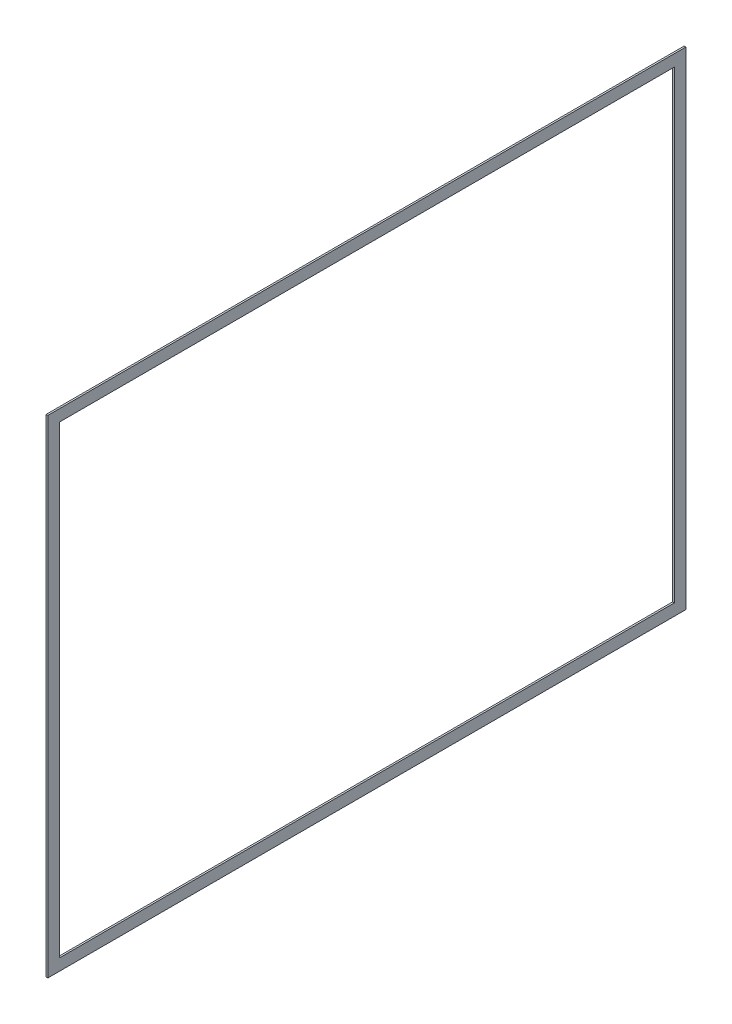
ISO-10303-21;
HEADER;
FILE_DESCRIPTION(('STEP AP214'),'2;1');
FILE_NAME('part.step','',(''),(''),'','','');
FILE_SCHEMA(('AUTOMOTIVE_DESIGN { 1 0 10303 214 1 1 1 1 }'));
ENDSEC;
DATA;
#1=APPLICATION_CONTEXT('core data for automotive mechanical design processes');
#2=APPLICATION_PROTOCOL_DEFINITION('international standard','automotive_design',2000,#1);
#3=PRODUCT_CONTEXT('',#1,'mechanical');
#4=PRODUCT('Part','Part','',(#3));
#5=PRODUCT_RELATED_PRODUCT_CATEGORY('part','',(#4));
#6=PRODUCT_DEFINITION_FORMATION('','',#4);
#7=PRODUCT_DEFINITION_CONTEXT('part definition',#1,'design');
#8=PRODUCT_DEFINITION('design','',#6,#7);
#9=PRODUCT_DEFINITION_SHAPE('','',#8);
#10=(LENGTH_UNIT() NAMED_UNIT(*) SI_UNIT(.MILLI.,.METRE.));
#11=(NAMED_UNIT(*) PLANE_ANGLE_UNIT() SI_UNIT($,.RADIAN.));
#12=(NAMED_UNIT(*) SI_UNIT($,.STERADIAN.) SOLID_ANGLE_UNIT());
#13=UNCERTAINTY_MEASURE_WITH_UNIT(LENGTH_MEASURE(1.E-05),#10,'distance_accuracy_value','');
#14=(GEOMETRIC_REPRESENTATION_CONTEXT(3) GLOBAL_UNCERTAINTY_ASSIGNED_CONTEXT((#13)) GLOBAL_UNIT_ASSIGNED_CONTEXT((#10,
#11,#12)) REPRESENTATION_CONTEXT('',''));
#15=CARTESIAN_POINT('',(0.,0.,0.));
#16=DIRECTION('',(0.,0.,1.));
#17=DIRECTION('',(1.,0.,0.));
#18=AXIS2_PLACEMENT_3D('',#15,#16,#17);
#19=CARTESIAN_POINT('',(537.21,0.,698.525000000038));
#20=DIRECTION('',(1.,0.,0.));
#21=DIRECTION('',(0.,0.,-1.));
#22=AXIS2_PLACEMENT_3D('',#19,#20,#21);
#23=PLANE('',#22);
#24=DIRECTION('',(0.,0.,-1.));
#25=VECTOR('',#24,1.);
#26=CARTESIAN_POINT('',(537.21,508.,417.48526692391));
#27=LINE('',#26,#25);
#28=CARTESIAN_POINT('',(537.21,508.,25.4));
#29=VERTEX_POINT('',#28);
#30=CARTESIAN_POINT('',(537.21,508.,1371.6));
#31=VERTEX_POINT('',#30);
#32=EDGE_CURVE('E109',#29,#31,#27,.F.);
#33=ORIENTED_EDGE('',*,*,#32,.F.);
#34=DIRECTION('',(0.,1.,0.));
#35=VECTOR('',#34,1.);
#36=CARTESIAN_POINT('',(537.21,20.8030939102161,25.4));
#37=LINE('',#36,#35);
#38=CARTESIAN_POINT('',(537.21,-508.,25.4));
#39=VERTEX_POINT('',#38);
#40=EDGE_CURVE('E116',#29,#39,#37,.F.);
#41=ORIENTED_EDGE('',*,*,#40,.T.);
#42=DIRECTION('',(0.,0.,-1.));
#43=VECTOR('',#42,1.);
#44=CARTESIAN_POINT('',(537.21,-508.,417.48526692391));
#45=LINE('',#44,#43);
#46=CARTESIAN_POINT('',(537.21,-508.,1371.6));
#47=VERTEX_POINT('',#46);
#48=EDGE_CURVE('E119',#39,#47,#45,.F.);
#49=ORIENTED_EDGE('',*,*,#48,.T.);
#50=DIRECTION('',(0.,1.,0.));
#51=VECTOR('',#50,1.);
#52=CARTESIAN_POINT('',(537.21,-61.4601382255534,1371.6));
#53=LINE('',#52,#51);
#54=EDGE_CURVE('E107',#31,#47,#53,.F.);
#55=ORIENTED_EDGE('',*,*,#54,.F.);
#56=EDGE_LOOP('',(#33,#41,#49,#55));
#57=FACE_BOUND('',#56,.T.);
#58=DIRECTION('',(0.,1.,0.));
#59=VECTOR('',#58,1.);
#60=CARTESIAN_POINT('',(537.21,20.8030939102161,0.));
#61=LINE('',#60,#59);
#62=CARTESIAN_POINT('',(537.21,533.4,0.));
#63=VERTEX_POINT('',#62);
#64=CARTESIAN_POINT('',(537.21,-533.4,0.));
#65=VERTEX_POINT('',#64);
#66=EDGE_CURVE('E79',#63,#65,#61,.F.);
#67=ORIENTED_EDGE('',*,*,#66,.F.);
#68=DIRECTION('',(0.,0.,-1.));
#69=VECTOR('',#68,1.);
#70=CARTESIAN_POINT('',(537.21,533.4,417.48526692391));
#71=LINE('',#70,#69);
#72=CARTESIAN_POINT('',(537.21,533.4,1397.));
#73=VERTEX_POINT('',#72);
#74=EDGE_CURVE('E98',#63,#73,#71,.F.);
#75=ORIENTED_EDGE('',*,*,#74,.T.);
#76=DIRECTION('',(0.,1.,0.));
#77=VECTOR('',#76,1.);
#78=CARTESIAN_POINT('',(537.21,-586.839999999898,1397.));
#79=LINE('',#78,#77);
#80=CARTESIAN_POINT('',(537.21,-533.4,1397.));
#81=VERTEX_POINT('',#80);
#82=EDGE_CURVE('E90',#81,#73,#79,.T.);
#83=ORIENTED_EDGE('',*,*,#82,.F.);
#84=DIRECTION('',(0.,0.,-1.));
#85=VECTOR('',#84,1.);
#86=CARTESIAN_POINT('',(537.21,-533.4,417.48526692391));
#87=LINE('',#86,#85);
#88=EDGE_CURVE('E19',#65,#81,#87,.F.);
#89=ORIENTED_EDGE('',*,*,#88,.F.);
#90=EDGE_LOOP('',(#67,#75,#83,#89));
#91=FACE_BOUND('',#90,.T.);
#92=ADVANCED_FACE('F16',(#57,#91),#23,.T.);
#93=CARTESIAN_POINT('',(537.21,-533.4,417.48526692391));
#94=DIRECTION('',(0.,-1.,0.));
#95=DIRECTION('',(0.,0.,-1.));
#96=AXIS2_PLACEMENT_3D('',#93,#94,#95);
#97=PLANE('',#96);
#98=ORIENTED_EDGE('',*,*,#88,.T.);
#99=DIRECTION('',(1.,0.,0.));
#100=VECTOR('',#99,1.);
#101=CARTESIAN_POINT('',(537.21,-533.4,1397.));
#102=LINE('',#101,#100);
#103=CARTESIAN_POINT('',(533.4,-533.4,1397.));
#104=VERTEX_POINT('',#103);
#105=EDGE_CURVE('E102',#104,#81,#102,.T.);
#106=ORIENTED_EDGE('',*,*,#105,.F.);
#107=DIRECTION('',(0.,0.,-1.));
#108=VECTOR('',#107,1.);
#109=CARTESIAN_POINT('',(533.4,-533.4,698.525000000038));
#110=LINE('',#109,#108);
#111=CARTESIAN_POINT('',(533.4,-533.4,0.));
#112=VERTEX_POINT('',#111);
#113=EDGE_CURVE('E96',#104,#112,#110,.T.);
#114=ORIENTED_EDGE('',*,*,#113,.T.);
#115=DIRECTION('',(-1.,0.,0.));
#116=VECTOR('',#115,1.);
#117=CARTESIAN_POINT('',(537.21,-533.4,0.));
#118=LINE('',#117,#116);
#119=EDGE_CURVE('E86',#65,#112,#118,.T.);
#120=ORIENTED_EDGE('',*,*,#119,.F.);
#121=EDGE_LOOP('',(#98,#106,#114,#120));
#122=FACE_BOUND('',#121,.T.);
#123=ADVANCED_FACE('F95',(#122),#97,.T.);
#124=CARTESIAN_POINT('',(537.21,20.8030939102161,0.));
#125=DIRECTION('',(0.,0.,-1.));
#126=DIRECTION('',(-1.,0.,0.));
#127=AXIS2_PLACEMENT_3D('',#124,#125,#126);
#128=PLANE('',#127);
#129=ORIENTED_EDGE('',*,*,#66,.T.);
#130=ORIENTED_EDGE('',*,*,#119,.T.);
#131=DIRECTION('',(0.,1.,0.));
#132=VECTOR('',#131,1.);
#133=CARTESIAN_POINT('',(533.4,0.,0.));
#134=LINE('',#133,#132);
#135=CARTESIAN_POINT('',(533.4,533.4,0.));
#136=VERTEX_POINT('',#135);
#137=EDGE_CURVE('E126',#112,#136,#134,.T.);
#138=ORIENTED_EDGE('',*,*,#137,.T.);
#139=DIRECTION('',(1.,0.,0.));
#140=VECTOR('',#139,1.);
#141=CARTESIAN_POINT('',(537.21,533.4,0.));
#142=LINE('',#141,#140);
#143=EDGE_CURVE('E88',#136,#63,#142,.T.);
#144=ORIENTED_EDGE('',*,*,#143,.T.);
#145=EDGE_LOOP('',(#129,#130,#138,#144));
#146=FACE_BOUND('',#145,.T.);
#147=ADVANCED_FACE('F83',(#146),#128,.T.);
#148=CARTESIAN_POINT('',(537.21,533.4,417.48526692391));
#149=DIRECTION('',(0.,-1.,0.));
#150=DIRECTION('',(0.,0.,-1.));
#151=AXIS2_PLACEMENT_3D('',#148,#149,#150);
#152=PLANE('',#151);
#153=DIRECTION('',(1.,0.,0.));
#154=VECTOR('',#153,1.);
#155=CARTESIAN_POINT('',(537.21,533.4,1397.));
#156=LINE('',#155,#154);
#157=CARTESIAN_POINT('',(533.4,533.4,1397.));
#158=VERTEX_POINT('',#157);
#159=EDGE_CURVE('E105',#73,#158,#156,.F.);
#160=ORIENTED_EDGE('',*,*,#159,.F.);
#161=ORIENTED_EDGE('',*,*,#74,.F.);
#162=ORIENTED_EDGE('',*,*,#143,.F.);
#163=DIRECTION('',(0.,0.,-1.));
#164=VECTOR('',#163,1.);
#165=CARTESIAN_POINT('',(533.4,533.4,698.525000000038));
#166=LINE('',#165,#164);
#167=EDGE_CURVE('E128',#136,#158,#166,.F.);
#168=ORIENTED_EDGE('',*,*,#167,.T.);
#169=EDGE_LOOP('',(#160,#161,#162,#168));
#170=FACE_BOUND('',#169,.T.);
#171=ADVANCED_FACE('F174',(#170),#152,.F.);
#172=CARTESIAN_POINT('',(537.21,-586.839999999898,1397.));
#173=DIRECTION('',(0.,0.,1.));
#174=DIRECTION('',(1.,0.,0.));
#175=AXIS2_PLACEMENT_3D('',#172,#173,#174);
#176=PLANE('',#175);
#177=ORIENTED_EDGE('',*,*,#82,.T.);
#178=ORIENTED_EDGE('',*,*,#159,.T.);
#179=DIRECTION('',(0.,1.,0.));
#180=VECTOR('',#179,1.);
#181=CARTESIAN_POINT('',(533.4,0.,1397.));
#182=LINE('',#181,#180);
#183=EDGE_CURVE('E131',#158,#104,#182,.F.);
#184=ORIENTED_EDGE('',*,*,#183,.T.);
#185=ORIENTED_EDGE('',*,*,#105,.T.);
#186=EDGE_LOOP('',(#177,#178,#184,#185));
#187=FACE_BOUND('',#186,.T.);
#188=ADVANCED_FACE('F171',(#187),#176,.T.);
#189=CARTESIAN_POINT('',(537.21,-61.4601382255534,1371.6));
#190=DIRECTION('',(0.,0.,-1.));
#191=DIRECTION('',(-1.,0.,0.));
#192=AXIS2_PLACEMENT_3D('',#189,#190,#191);
#193=PLANE('',#192);
#194=ORIENTED_EDGE('',*,*,#54,.T.);
#195=DIRECTION('',(1.,0.,0.));
#196=VECTOR('',#195,1.);
#197=CARTESIAN_POINT('',(537.21,-508.,1371.6));
#198=LINE('',#197,#196);
#199=CARTESIAN_POINT('',(533.4,-508.,1371.6));
#200=VERTEX_POINT('',#199);
#201=EDGE_CURVE('E122',#47,#200,#198,.F.);
#202=ORIENTED_EDGE('',*,*,#201,.T.);
#203=DIRECTION('',(0.,1.,0.));
#204=VECTOR('',#203,1.);
#205=CARTESIAN_POINT('',(533.4,0.,1371.6));
#206=LINE('',#205,#204);
#207=CARTESIAN_POINT('',(533.4,508.,1371.6));
#208=VERTEX_POINT('',#207);
#209=EDGE_CURVE('E134',#200,#208,#206,.T.);
#210=ORIENTED_EDGE('',*,*,#209,.T.);
#211=DIRECTION('',(1.,0.,0.));
#212=VECTOR('',#211,1.);
#213=CARTESIAN_POINT('',(537.21,508.,1371.6));
#214=LINE('',#213,#212);
#215=EDGE_CURVE('E111',#31,#208,#214,.F.);
#216=ORIENTED_EDGE('',*,*,#215,.F.);
#217=EDGE_LOOP('',(#194,#202,#210,#216));
#218=FACE_BOUND('',#217,.T.);
#219=ADVANCED_FACE('F154',(#218),#193,.T.);
#220=CARTESIAN_POINT('',(537.21,508.,417.48526692391));
#221=DIRECTION('',(0.,-1.,0.));
#222=DIRECTION('',(0.,0.,-1.));
#223=AXIS2_PLACEMENT_3D('',#220,#221,#222);
#224=PLANE('',#223);
#225=ORIENTED_EDGE('',*,*,#32,.T.);
#226=ORIENTED_EDGE('',*,*,#215,.T.);
#227=DIRECTION('',(0.,0.,-1.));
#228=VECTOR('',#227,1.);
#229=CARTESIAN_POINT('',(533.4,508.,698.525000000038));
#230=LINE('',#229,#228);
#231=CARTESIAN_POINT('',(533.4,508.,25.4));
#232=VERTEX_POINT('',#231);
#233=EDGE_CURVE('E137',#208,#232,#230,.T.);
#234=ORIENTED_EDGE('',*,*,#233,.T.);
#235=DIRECTION('',(-1.,0.,0.));
#236=VECTOR('',#235,1.);
#237=CARTESIAN_POINT('',(537.21,508.,25.4));
#238=LINE('',#237,#236);
#239=EDGE_CURVE('E113',#232,#29,#238,.F.);
#240=ORIENTED_EDGE('',*,*,#239,.T.);
#241=EDGE_LOOP('',(#225,#226,#234,#240));
#242=FACE_BOUND('',#241,.T.);
#243=ADVANCED_FACE('F150',(#242),#224,.T.);
#244=CARTESIAN_POINT('',(537.21,20.8030939102161,25.4));
#245=DIRECTION('',(0.,0.,-1.));
#246=DIRECTION('',(-1.,0.,0.));
#247=AXIS2_PLACEMENT_3D('',#244,#245,#246);
#248=PLANE('',#247);
#249=DIRECTION('',(1.,0.,0.));
#250=VECTOR('',#249,1.);
#251=CARTESIAN_POINT('',(537.21,-508.,25.4));
#252=LINE('',#251,#250);
#253=CARTESIAN_POINT('',(533.4,-508.,25.4));
#254=VERTEX_POINT('',#253);
#255=EDGE_CURVE('E33',#254,#39,#252,.T.);
#256=ORIENTED_EDGE('',*,*,#255,.T.);
#257=ORIENTED_EDGE('',*,*,#40,.F.);
#258=ORIENTED_EDGE('',*,*,#239,.F.);
#259=DIRECTION('',(0.,1.,0.));
#260=VECTOR('',#259,1.);
#261=CARTESIAN_POINT('',(533.4,0.,25.4));
#262=LINE('',#261,#260);
#263=EDGE_CURVE('E25',#232,#254,#262,.F.);
#264=ORIENTED_EDGE('',*,*,#263,.T.);
#265=EDGE_LOOP('',(#256,#257,#258,#264));
#266=FACE_BOUND('',#265,.T.);
#267=ADVANCED_FACE('F143',(#266),#248,.F.);
#268=CARTESIAN_POINT('',(537.21,-508.,417.48526692391));
#269=DIRECTION('',(0.,-1.,0.));
#270=DIRECTION('',(0.,0.,-1.));
#271=AXIS2_PLACEMENT_3D('',#268,#269,#270);
#272=PLANE('',#271);
#273=ORIENTED_EDGE('',*,*,#201,.F.);
#274=ORIENTED_EDGE('',*,*,#48,.F.);
#275=ORIENTED_EDGE('',*,*,#255,.F.);
#276=DIRECTION('',(0.,0.,-1.));
#277=VECTOR('',#276,1.);
#278=CARTESIAN_POINT('',(533.4,-508.,698.525000000038));
#279=LINE('',#278,#277);
#280=EDGE_CURVE('E11',#254,#200,#279,.F.);
#281=ORIENTED_EDGE('',*,*,#280,.T.);
#282=EDGE_LOOP('',(#273,#274,#275,#281));
#283=FACE_BOUND('',#282,.T.);
#284=ADVANCED_FACE('F156',(#283),#272,.F.);
#285=CARTESIAN_POINT('',(533.4,0.,698.525000000038));
#286=DIRECTION('',(1.,0.,0.));
#287=DIRECTION('',(0.,0.,-1.));
#288=AXIS2_PLACEMENT_3D('',#285,#286,#287);
#289=PLANE('',#288);
#290=ORIENTED_EDGE('',*,*,#263,.F.);
#291=ORIENTED_EDGE('',*,*,#233,.F.);
#292=ORIENTED_EDGE('',*,*,#209,.F.);
#293=ORIENTED_EDGE('',*,*,#280,.F.);
#294=EDGE_LOOP('',(#290,#291,#292,#293));
#295=FACE_BOUND('',#294,.T.);
#296=ORIENTED_EDGE('',*,*,#167,.F.);
#297=ORIENTED_EDGE('',*,*,#137,.F.);
#298=ORIENTED_EDGE('',*,*,#113,.F.);
#299=ORIENTED_EDGE('',*,*,#183,.F.);
#300=EDGE_LOOP('',(#296,#297,#298,#299));
#301=FACE_BOUND('',#300,.T.);
#302=ADVANCED_FACE('F147',(#295,#301),#289,.F.);
#303=CLOSED_SHELL('',(#92,#123,#147,#171,#188,#219,#243,#267,#284,#302));
#304=MANIFOLD_SOLID_BREP('B1',#303);
#305=ADVANCED_BREP_SHAPE_REPRESENTATION('',(#18,#304),#14);
#306=SHAPE_DEFINITION_REPRESENTATION(#9,#305);
ENDSEC;
END-ISO-10303-21;
